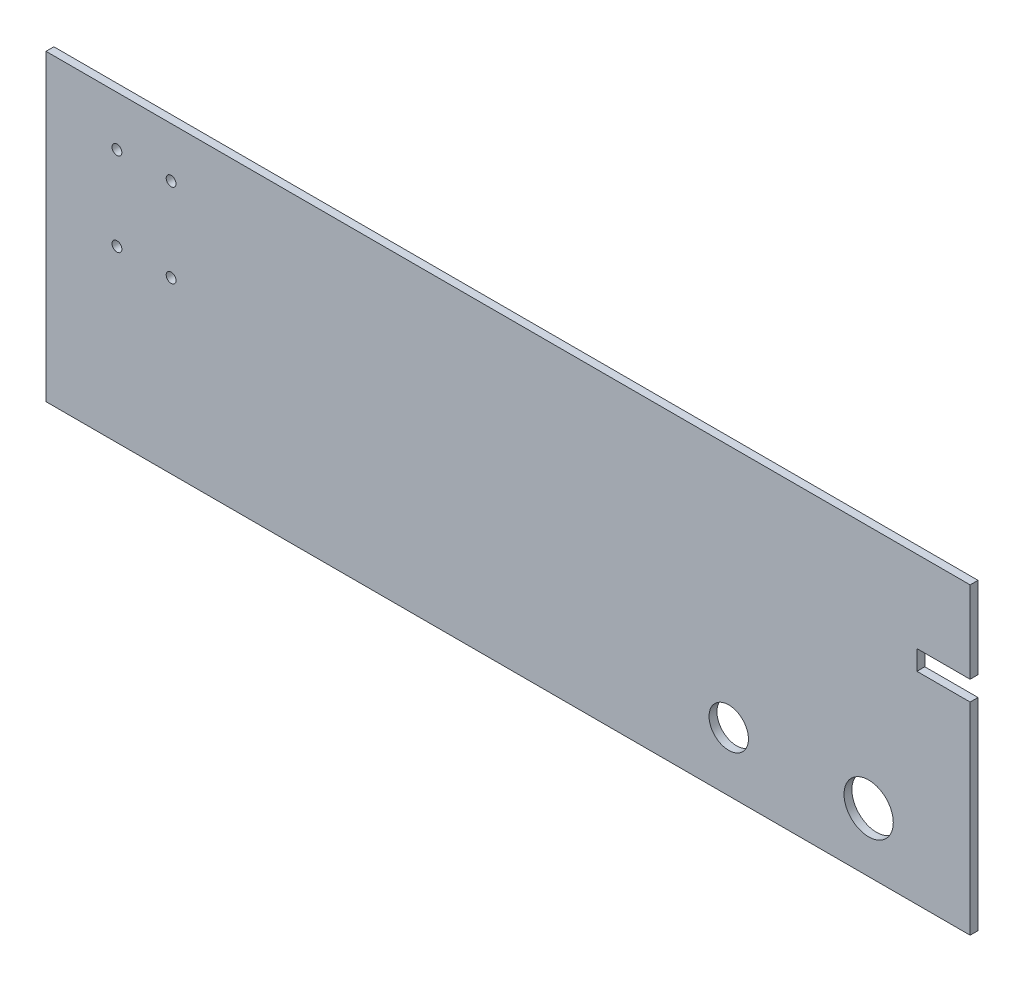
ISO-10303-21;
HEADER;
FILE_DESCRIPTION(('STEP AP214'),'2;1');
FILE_NAME('part.step','',(''),(''),'','','');
FILE_SCHEMA(('AUTOMOTIVE_DESIGN { 1 0 10303 214 1 1 1 1 }'));
ENDSEC;
DATA;
#1=APPLICATION_CONTEXT('core data for automotive mechanical design processes');
#2=APPLICATION_PROTOCOL_DEFINITION('international standard','automotive_design',2000,#1);
#3=PRODUCT_CONTEXT('',#1,'mechanical');
#4=PRODUCT('Part','Part','',(#3));
#5=PRODUCT_RELATED_PRODUCT_CATEGORY('part','',(#4));
#6=PRODUCT_DEFINITION_FORMATION('','',#4);
#7=PRODUCT_DEFINITION_CONTEXT('part definition',#1,'design');
#8=PRODUCT_DEFINITION('design','',#6,#7);
#9=PRODUCT_DEFINITION_SHAPE('','',#8);
#10=(LENGTH_UNIT() NAMED_UNIT(*) SI_UNIT(.MILLI.,.METRE.));
#11=(NAMED_UNIT(*) PLANE_ANGLE_UNIT() SI_UNIT($,.RADIAN.));
#12=(NAMED_UNIT(*) SI_UNIT($,.STERADIAN.) SOLID_ANGLE_UNIT());
#13=UNCERTAINTY_MEASURE_WITH_UNIT(LENGTH_MEASURE(1.E-05),#10,'distance_accuracy_value','');
#14=(GEOMETRIC_REPRESENTATION_CONTEXT(3) GLOBAL_UNCERTAINTY_ASSIGNED_CONTEXT((#13)) GLOBAL_UNIT_ASSIGNED_CONTEXT((#10,
#11,#12)) REPRESENTATION_CONTEXT('',''));
#15=CARTESIAN_POINT('',(0.,0.,0.));
#16=DIRECTION('',(0.,0.,1.));
#17=DIRECTION('',(1.,0.,0.));
#18=AXIS2_PLACEMENT_3D('',#15,#16,#17);
#19=CARTESIAN_POINT('',(-693.,248.,-8.));
#20=DIRECTION('',(-1.,0.,0.));
#21=DIRECTION('',(0.,0.,1.));
#22=AXIS2_PLACEMENT_3D('',#19,#20,#21);
#23=PLANE('',#22);
#24=DIRECTION('',(0.,-1.,0.));
#25=VECTOR('',#24,1.);
#26=CARTESIAN_POINT('',(-693.,248.,0.));
#27=LINE('',#26,#25);
#28=CARTESIAN_POINT('',(-693.,248.,0.));
#29=VERTEX_POINT('',#28);
#30=CARTESIAN_POINT('',(-693.,-60.,0.));
#31=VERTEX_POINT('',#30);
#32=EDGE_CURVE('E106',#29,#31,#27,.T.);
#33=ORIENTED_EDGE('',*,*,#32,.F.);
#34=DIRECTION('',(0.,0.,1.));
#35=VECTOR('',#34,1.);
#36=CARTESIAN_POINT('',(-693.,248.,-8.));
#37=LINE('',#36,#35);
#38=CARTESIAN_POINT('',(-693.,248.,-8.));
#39=VERTEX_POINT('',#38);
#40=EDGE_CURVE('E11',#39,#29,#37,.T.);
#41=ORIENTED_EDGE('',*,*,#40,.F.);
#42=DIRECTION('',(0.,-1.,0.));
#43=VECTOR('',#42,1.);
#44=CARTESIAN_POINT('',(-693.,248.,-8.));
#45=LINE('',#44,#43);
#46=CARTESIAN_POINT('',(-693.,-60.,-8.));
#47=VERTEX_POINT('',#46);
#48=EDGE_CURVE('E108',#39,#47,#45,.T.);
#49=ORIENTED_EDGE('',*,*,#48,.T.);
#50=DIRECTION('',(0.,0.,1.));
#51=VECTOR('',#50,1.);
#52=CARTESIAN_POINT('',(-693.,-60.,-8.));
#53=LINE('',#52,#51);
#54=EDGE_CURVE('E44',#47,#31,#53,.T.);
#55=ORIENTED_EDGE('',*,*,#54,.T.);
#56=EDGE_LOOP('',(#33,#41,#49,#55));
#57=FACE_BOUND('',#56,.T.);
#58=ADVANCED_FACE('F41',(#57),#23,.T.);
#59=CARTESIAN_POINT('',(-693.,248.,-8.));
#60=DIRECTION('',(0.,1.,0.));
#61=DIRECTION('',(0.,0.,1.));
#62=AXIS2_PLACEMENT_3D('',#59,#60,#61);
#63=PLANE('',#62);
#64=DIRECTION('',(-1.,0.,0.));
#65=VECTOR('',#64,1.);
#66=CARTESIAN_POINT('',(-693.,248.,0.));
#67=LINE('',#66,#65);
#68=CARTESIAN_POINT('',(245.,248.,0.));
#69=VERTEX_POINT('',#68);
#70=EDGE_CURVE('E126',#69,#29,#67,.T.);
#71=ORIENTED_EDGE('',*,*,#70,.F.);
#72=DIRECTION('',(0.,0.,1.));
#73=VECTOR('',#72,1.);
#74=CARTESIAN_POINT('',(245.,248.,-8.));
#75=LINE('',#74,#73);
#76=CARTESIAN_POINT('',(245.,248.,-8.));
#77=VERTEX_POINT('',#76);
#78=EDGE_CURVE('E50',#77,#69,#75,.T.);
#79=ORIENTED_EDGE('',*,*,#78,.F.);
#80=DIRECTION('',(-1.,0.,0.));
#81=VECTOR('',#80,1.);
#82=CARTESIAN_POINT('',(-693.,248.,-8.));
#83=LINE('',#82,#81);
#84=EDGE_CURVE('E114',#77,#39,#83,.T.);
#85=ORIENTED_EDGE('',*,*,#84,.T.);
#86=ORIENTED_EDGE('',*,*,#40,.T.);
#87=EDGE_LOOP('',(#71,#79,#85,#86));
#88=FACE_BOUND('',#87,.T.);
#89=ADVANCED_FACE('F262',(#88),#63,.T.);
#90=CARTESIAN_POINT('',(245.,248.,-8.));
#91=DIRECTION('',(1.,0.,0.));
#92=DIRECTION('',(0.,0.,-1.));
#93=AXIS2_PLACEMENT_3D('',#90,#91,#92);
#94=PLANE('',#93);
#95=DIRECTION('',(0.,1.,0.));
#96=VECTOR('',#95,1.);
#97=CARTESIAN_POINT('',(245.,248.,0.));
#98=LINE('',#97,#96);
#99=CARTESIAN_POINT('',(245.,165.,0.));
#100=VERTEX_POINT('',#99);
#101=EDGE_CURVE('E152',#100,#69,#98,.T.);
#102=ORIENTED_EDGE('',*,*,#101,.F.);
#103=DIRECTION('',(0.,0.,1.));
#104=VECTOR('',#103,1.);
#105=CARTESIAN_POINT('',(245.,165.,-8.));
#106=LINE('',#105,#104);
#107=CARTESIAN_POINT('',(245.,165.,-8.));
#108=VERTEX_POINT('',#107);
#109=EDGE_CURVE('E184',#108,#100,#106,.T.);
#110=ORIENTED_EDGE('',*,*,#109,.F.);
#111=DIRECTION('',(0.,1.,0.));
#112=VECTOR('',#111,1.);
#113=CARTESIAN_POINT('',(245.,248.,-8.));
#114=LINE('',#113,#112);
#115=EDGE_CURVE('E177',#108,#77,#114,.T.);
#116=ORIENTED_EDGE('',*,*,#115,.T.);
#117=ORIENTED_EDGE('',*,*,#78,.T.);
#118=EDGE_LOOP('',(#102,#110,#116,#117));
#119=FACE_BOUND('',#118,.T.);
#120=ADVANCED_FACE('F266',(#119),#94,.T.);
#121=CARTESIAN_POINT('',(245.,165.,-8.));
#122=DIRECTION('',(0.,-1.,0.));
#123=DIRECTION('',(0.,0.,-1.));
#124=AXIS2_PLACEMENT_3D('',#121,#122,#123);
#125=PLANE('',#124);
#126=DIRECTION('',(1.,0.,0.));
#127=VECTOR('',#126,1.);
#128=CARTESIAN_POINT('',(245.,165.,0.));
#129=LINE('',#128,#127);
#130=CARTESIAN_POINT('',(191.,165.,0.));
#131=VERTEX_POINT('',#130);
#132=EDGE_CURVE('E148',#131,#100,#129,.T.);
#133=ORIENTED_EDGE('',*,*,#132,.F.);
#134=DIRECTION('',(0.,0.,1.));
#135=VECTOR('',#134,1.);
#136=CARTESIAN_POINT('',(191.,165.,-8.));
#137=LINE('',#136,#135);
#138=CARTESIAN_POINT('',(191.,165.,-8.));
#139=VERTEX_POINT('',#138);
#140=EDGE_CURVE('E187',#139,#131,#137,.T.);
#141=ORIENTED_EDGE('',*,*,#140,.F.);
#142=DIRECTION('',(1.,0.,0.));
#143=VECTOR('',#142,1.);
#144=CARTESIAN_POINT('',(245.,165.,-8.));
#145=LINE('',#144,#143);
#146=EDGE_CURVE('E173',#139,#108,#145,.T.);
#147=ORIENTED_EDGE('',*,*,#146,.T.);
#148=ORIENTED_EDGE('',*,*,#109,.T.);
#149=EDGE_LOOP('',(#133,#141,#147,#148));
#150=FACE_BOUND('',#149,.T.);
#151=ADVANCED_FACE('F271',(#150),#125,.T.);
#152=CARTESIAN_POINT('',(191.,165.,-8.));
#153=DIRECTION('',(1.,0.,0.));
#154=DIRECTION('',(0.,0.,-1.));
#155=AXIS2_PLACEMENT_3D('',#152,#153,#154);
#156=PLANE('',#155);
#157=DIRECTION('',(0.,1.,0.));
#158=VECTOR('',#157,1.);
#159=CARTESIAN_POINT('',(191.,165.,0.));
#160=LINE('',#159,#158);
#161=CARTESIAN_POINT('',(191.,145.,0.));
#162=VERTEX_POINT('',#161);
#163=EDGE_CURVE('E144',#162,#131,#160,.T.);
#164=ORIENTED_EDGE('',*,*,#163,.F.);
#165=DIRECTION('',(0.,0.,1.));
#166=VECTOR('',#165,1.);
#167=CARTESIAN_POINT('',(191.,145.,-8.));
#168=LINE('',#167,#166);
#169=CARTESIAN_POINT('',(191.,145.,-8.));
#170=VERTEX_POINT('',#169);
#171=EDGE_CURVE('E190',#170,#162,#168,.T.);
#172=ORIENTED_EDGE('',*,*,#171,.F.);
#173=DIRECTION('',(0.,1.,0.));
#174=VECTOR('',#173,1.);
#175=CARTESIAN_POINT('',(191.,165.,-8.));
#176=LINE('',#175,#174);
#177=EDGE_CURVE('E169',#170,#139,#176,.T.);
#178=ORIENTED_EDGE('',*,*,#177,.T.);
#179=ORIENTED_EDGE('',*,*,#140,.T.);
#180=EDGE_LOOP('',(#164,#172,#178,#179));
#181=FACE_BOUND('',#180,.T.);
#182=ADVANCED_FACE('F278',(#181),#156,.T.);
#183=CARTESIAN_POINT('',(245.,145.,-8.));
#184=DIRECTION('',(0.,1.,0.));
#185=DIRECTION('',(0.,0.,1.));
#186=AXIS2_PLACEMENT_3D('',#183,#184,#185);
#187=PLANE('',#186);
#188=DIRECTION('',(-1.,0.,0.));
#189=VECTOR('',#188,1.);
#190=CARTESIAN_POINT('',(245.,145.,0.));
#191=LINE('',#190,#189);
#192=CARTESIAN_POINT('',(245.,145.,0.));
#193=VERTEX_POINT('',#192);
#194=EDGE_CURVE('E140',#193,#162,#191,.T.);
#195=ORIENTED_EDGE('',*,*,#194,.F.);
#196=DIRECTION('',(0.,0.,1.));
#197=VECTOR('',#196,1.);
#198=CARTESIAN_POINT('',(245.,145.,-8.));
#199=LINE('',#198,#197);
#200=CARTESIAN_POINT('',(245.,145.,-8.));
#201=VERTEX_POINT('',#200);
#202=EDGE_CURVE('E193',#201,#193,#199,.T.);
#203=ORIENTED_EDGE('',*,*,#202,.F.);
#204=DIRECTION('',(-1.,0.,0.));
#205=VECTOR('',#204,1.);
#206=CARTESIAN_POINT('',(245.,145.,-8.));
#207=LINE('',#206,#205);
#208=EDGE_CURVE('E165',#201,#170,#207,.T.);
#209=ORIENTED_EDGE('',*,*,#208,.T.);
#210=ORIENTED_EDGE('',*,*,#171,.T.);
#211=EDGE_LOOP('',(#195,#203,#209,#210));
#212=FACE_BOUND('',#211,.T.);
#213=ADVANCED_FACE('F282',(#212),#187,.T.);
#214=CARTESIAN_POINT('',(245.,145.,-8.));
#215=DIRECTION('',(1.,0.,0.));
#216=DIRECTION('',(0.,0.,-1.));
#217=AXIS2_PLACEMENT_3D('',#214,#215,#216);
#218=PLANE('',#217);
#219=DIRECTION('',(0.,1.,0.));
#220=VECTOR('',#219,1.);
#221=CARTESIAN_POINT('',(245.,145.,0.));
#222=LINE('',#221,#220);
#223=CARTESIAN_POINT('',(245.,-60.,0.));
#224=VERTEX_POINT('',#223);
#225=EDGE_CURVE('E122',#224,#193,#222,.T.);
#226=ORIENTED_EDGE('',*,*,#225,.F.);
#227=DIRECTION('',(0.,0.,1.));
#228=VECTOR('',#227,1.);
#229=CARTESIAN_POINT('',(245.,-60.,-8.));
#230=LINE('',#229,#228);
#231=CARTESIAN_POINT('',(245.,-60.,-8.));
#232=VERTEX_POINT('',#231);
#233=EDGE_CURVE('E113',#232,#224,#230,.T.);
#234=ORIENTED_EDGE('',*,*,#233,.F.);
#235=DIRECTION('',(0.,1.,0.));
#236=VECTOR('',#235,1.);
#237=CARTESIAN_POINT('',(245.,145.,-8.));
#238=LINE('',#237,#236);
#239=EDGE_CURVE('E161',#232,#201,#238,.T.);
#240=ORIENTED_EDGE('',*,*,#239,.T.);
#241=ORIENTED_EDGE('',*,*,#202,.T.);
#242=EDGE_LOOP('',(#226,#234,#240,#241));
#243=FACE_BOUND('',#242,.T.);
#244=ADVANCED_FACE('F286',(#243),#218,.T.);
#245=CARTESIAN_POINT('',(-693.,-60.,-8.));
#246=DIRECTION('',(0.,-1.,0.));
#247=DIRECTION('',(0.,0.,-1.));
#248=AXIS2_PLACEMENT_3D('',#245,#246,#247);
#249=PLANE('',#248);
#250=DIRECTION('',(1.,0.,0.));
#251=VECTOR('',#250,1.);
#252=CARTESIAN_POINT('',(-693.,-60.,0.));
#253=LINE('',#252,#251);
#254=EDGE_CURVE('E116',#31,#224,#253,.T.);
#255=ORIENTED_EDGE('',*,*,#254,.F.);
#256=ORIENTED_EDGE('',*,*,#54,.F.);
#257=DIRECTION('',(1.,0.,0.));
#258=VECTOR('',#257,1.);
#259=CARTESIAN_POINT('',(-693.,-60.,-8.));
#260=LINE('',#259,#258);
#261=EDGE_CURVE('E158',#47,#232,#260,.T.);
#262=ORIENTED_EDGE('',*,*,#261,.T.);
#263=ORIENTED_EDGE('',*,*,#233,.T.);
#264=EDGE_LOOP('',(#255,#256,#262,#263));
#265=FACE_BOUND('',#264,.T.);
#266=ADVANCED_FACE('F117',(#265),#249,.T.);
#267=CARTESIAN_POINT('',(-693.,-60.,-8.));
#268=DIRECTION('',(0.,0.,1.));
#269=DIRECTION('',(1.,0.,0.));
#270=AXIS2_PLACEMENT_3D('',#267,#268,#269);
#271=PLANE('',#270);
#272=CARTESIAN_POINT('',(142.,0.,-8.));
#273=DIRECTION('',(0.,0.,1.));
#274=DIRECTION('',(1.,0.,0.));
#275=AXIS2_PLACEMENT_3D('',#272,#273,#274);
#276=CIRCLE('',#275,25.);
#277=CARTESIAN_POINT('',(167.,0.,-8.));
#278=VERTEX_POINT('',#277);
#279=EDGE_CURVE('E204',#278,#278,#276,.T.);
#280=ORIENTED_EDGE('',*,*,#279,.T.);
#281=EDGE_LOOP('',(#280));
#282=FACE_BOUND('',#281,.T.);
#283=CARTESIAN_POINT('',(-621.,112.5,-8.));
#284=DIRECTION('',(0.,0.,1.));
#285=DIRECTION('',(-1.,0.,0.));
#286=AXIS2_PLACEMENT_3D('',#283,#284,#285);
#287=CIRCLE('',#286,5.00000000000005);
#288=CARTESIAN_POINT('',(-626.,112.5,-8.));
#289=VERTEX_POINT('',#288);
#290=EDGE_CURVE('E203',#289,#289,#287,.T.);
#291=ORIENTED_EDGE('',*,*,#290,.T.);
#292=EDGE_LOOP('',(#291));
#293=FACE_BOUND('',#292,.T.);
#294=CARTESIAN_POINT('',(-566.,112.5,-8.));
#295=DIRECTION('',(0.,0.,1.));
#296=DIRECTION('',(1.,0.,0.));
#297=AXIS2_PLACEMENT_3D('',#294,#295,#296);
#298=CIRCLE('',#297,5.00000000000005);
#299=CARTESIAN_POINT('',(-561.,112.5,-8.));
#300=VERTEX_POINT('',#299);
#301=EDGE_CURVE('E214',#300,#300,#298,.T.);
#302=ORIENTED_EDGE('',*,*,#301,.T.);
#303=EDGE_LOOP('',(#302));
#304=FACE_BOUND('',#303,.T.);
#305=CARTESIAN_POINT('',(-566.,197.5,-8.));
#306=DIRECTION('',(0.,0.,1.));
#307=DIRECTION('',(-1.,0.,0.));
#308=AXIS2_PLACEMENT_3D('',#305,#306,#307);
#309=CIRCLE('',#308,5.00000000000005);
#310=CARTESIAN_POINT('',(-571.,197.5,-8.));
#311=VERTEX_POINT('',#310);
#312=EDGE_CURVE('E213',#311,#311,#309,.T.);
#313=ORIENTED_EDGE('',*,*,#312,.T.);
#314=EDGE_LOOP('',(#313));
#315=FACE_BOUND('',#314,.T.);
#316=CARTESIAN_POINT('',(-621.,197.5,-8.));
#317=DIRECTION('',(0.,0.,1.));
#318=DIRECTION('',(1.,0.,0.));
#319=AXIS2_PLACEMENT_3D('',#316,#317,#318);
#320=CIRCLE('',#319,5.00000000000005);
#321=CARTESIAN_POINT('',(-616.,197.5,-8.));
#322=VERTEX_POINT('',#321);
#323=EDGE_CURVE('E199',#322,#322,#320,.T.);
#324=ORIENTED_EDGE('',*,*,#323,.T.);
#325=EDGE_LOOP('',(#324));
#326=FACE_BOUND('',#325,.T.);
#327=CARTESIAN_POINT('',(0.,0.,-8.));
#328=DIRECTION('',(0.,0.,1.));
#329=DIRECTION('',(1.,0.,0.));
#330=AXIS2_PLACEMENT_3D('',#327,#328,#329);
#331=CIRCLE('',#330,20.);
#332=CARTESIAN_POINT('',(20.,0.,-8.));
#333=VERTEX_POINT('',#332);
#334=EDGE_CURVE('E128',#333,#333,#331,.T.);
#335=ORIENTED_EDGE('',*,*,#334,.T.);
#336=EDGE_LOOP('',(#335));
#337=FACE_BOUND('',#336,.T.);
#338=ORIENTED_EDGE('',*,*,#48,.F.);
#339=ORIENTED_EDGE('',*,*,#84,.F.);
#340=ORIENTED_EDGE('',*,*,#115,.F.);
#341=ORIENTED_EDGE('',*,*,#146,.F.);
#342=ORIENTED_EDGE('',*,*,#177,.F.);
#343=ORIENTED_EDGE('',*,*,#208,.F.);
#344=ORIENTED_EDGE('',*,*,#239,.F.);
#345=ORIENTED_EDGE('',*,*,#261,.F.);
#346=EDGE_LOOP('',(#338,#339,#340,#341,#342,#343,#344,#345));
#347=FACE_BOUND('',#346,.T.);
#348=ADVANCED_FACE('F246',(#282,#293,#304,#315,#326,#337,#347),#271,.F.);
#349=CARTESIAN_POINT('',(-693.,-60.,0.));
#350=DIRECTION('',(0.,0.,1.));
#351=DIRECTION('',(1.,0.,0.));
#352=AXIS2_PLACEMENT_3D('',#349,#350,#351);
#353=PLANE('',#352);
#354=CARTESIAN_POINT('',(142.,0.,0.));
#355=DIRECTION('',(0.,0.,1.));
#356=DIRECTION('',(1.,0.,0.));
#357=AXIS2_PLACEMENT_3D('',#354,#355,#356);
#358=CIRCLE('',#357,25.);
#359=CARTESIAN_POINT('',(167.,0.,0.));
#360=VERTEX_POINT('',#359);
#361=EDGE_CURVE('E223',#360,#360,#358,.T.);
#362=ORIENTED_EDGE('',*,*,#361,.F.);
#363=EDGE_LOOP('',(#362));
#364=FACE_BOUND('',#363,.T.);
#365=CARTESIAN_POINT('',(-621.,112.5,0.));
#366=DIRECTION('',(0.,0.,1.));
#367=DIRECTION('',(-1.,0.,0.));
#368=AXIS2_PLACEMENT_3D('',#365,#366,#367);
#369=CIRCLE('',#368,5.00000000000005);
#370=CARTESIAN_POINT('',(-626.,112.5,0.));
#371=VERTEX_POINT('',#370);
#372=EDGE_CURVE('E200',#371,#371,#369,.T.);
#373=ORIENTED_EDGE('',*,*,#372,.F.);
#374=EDGE_LOOP('',(#373));
#375=FACE_BOUND('',#374,.T.);
#376=CARTESIAN_POINT('',(-566.,112.5,0.));
#377=DIRECTION('',(0.,0.,1.));
#378=DIRECTION('',(1.,0.,0.));
#379=AXIS2_PLACEMENT_3D('',#376,#377,#378);
#380=CIRCLE('',#379,5.00000000000005);
#381=CARTESIAN_POINT('',(-561.,112.5,0.));
#382=VERTEX_POINT('',#381);
#383=EDGE_CURVE('E207',#382,#382,#380,.T.);
#384=ORIENTED_EDGE('',*,*,#383,.F.);
#385=EDGE_LOOP('',(#384));
#386=FACE_BOUND('',#385,.T.);
#387=CARTESIAN_POINT('',(-566.,197.5,0.));
#388=DIRECTION('',(0.,0.,1.));
#389=DIRECTION('',(-1.,0.,0.));
#390=AXIS2_PLACEMENT_3D('',#387,#388,#389);
#391=CIRCLE('',#390,5.00000000000005);
#392=CARTESIAN_POINT('',(-571.,197.5,0.));
#393=VERTEX_POINT('',#392);
#394=EDGE_CURVE('E210',#393,#393,#391,.T.);
#395=ORIENTED_EDGE('',*,*,#394,.F.);
#396=EDGE_LOOP('',(#395));
#397=FACE_BOUND('',#396,.T.);
#398=CARTESIAN_POINT('',(-621.,197.5,0.));
#399=DIRECTION('',(0.,0.,1.));
#400=DIRECTION('',(1.,0.,0.));
#401=AXIS2_PLACEMENT_3D('',#398,#399,#400);
#402=CIRCLE('',#401,5.00000000000005);
#403=CARTESIAN_POINT('',(-616.,197.5,0.));
#404=VERTEX_POINT('',#403);
#405=EDGE_CURVE('E218',#404,#404,#402,.T.);
#406=ORIENTED_EDGE('',*,*,#405,.F.);
#407=EDGE_LOOP('',(#406));
#408=FACE_BOUND('',#407,.T.);
#409=CARTESIAN_POINT('',(0.,0.,0.));
#410=DIRECTION('',(0.,0.,1.));
#411=DIRECTION('',(1.,0.,0.));
#412=AXIS2_PLACEMENT_3D('',#409,#410,#411);
#413=CIRCLE('',#412,20.);
#414=CARTESIAN_POINT('',(20.,0.,0.));
#415=VERTEX_POINT('',#414);
#416=EDGE_CURVE('E134',#415,#415,#413,.T.);
#417=ORIENTED_EDGE('',*,*,#416,.F.);
#418=EDGE_LOOP('',(#417));
#419=FACE_BOUND('',#418,.T.);
#420=ORIENTED_EDGE('',*,*,#32,.T.);
#421=ORIENTED_EDGE('',*,*,#254,.T.);
#422=ORIENTED_EDGE('',*,*,#225,.T.);
#423=ORIENTED_EDGE('',*,*,#194,.T.);
#424=ORIENTED_EDGE('',*,*,#163,.T.);
#425=ORIENTED_EDGE('',*,*,#132,.T.);
#426=ORIENTED_EDGE('',*,*,#101,.T.);
#427=ORIENTED_EDGE('',*,*,#70,.T.);
#428=EDGE_LOOP('',(#420,#421,#422,#423,#424,#425,#426,#427));
#429=FACE_BOUND('',#428,.T.);
#430=ADVANCED_FACE('F124',(#364,#375,#386,#397,#408,#419,#429),#353,.T.);
#431=CARTESIAN_POINT('',(0.,0.,-8.));
#432=DIRECTION('',(0.,0.,1.));
#433=DIRECTION('',(1.,0.,0.));
#434=AXIS2_PLACEMENT_3D('',#431,#432,#433);
#435=CYLINDRICAL_SURFACE('',#434,20.);
#436=ORIENTED_EDGE('',*,*,#334,.F.);
#437=EDGE_LOOP('',(#436));
#438=FACE_BOUND('',#437,.T.);
#439=ORIENTED_EDGE('',*,*,#416,.T.);
#440=EDGE_LOOP('',(#439));
#441=FACE_BOUND('',#440,.T.);
#442=ADVANCED_FACE('F245',(#438,#441),#435,.F.);
#443=CARTESIAN_POINT('',(-621.,197.5,-8.));
#444=DIRECTION('',(0.,0.,1.));
#445=DIRECTION('',(1.,0.,0.));
#446=AXIS2_PLACEMENT_3D('',#443,#444,#445);
#447=CYLINDRICAL_SURFACE('',#446,5.00000000000005);
#448=ORIENTED_EDGE('',*,*,#323,.F.);
#449=EDGE_LOOP('',(#448));
#450=FACE_BOUND('',#449,.T.);
#451=ORIENTED_EDGE('',*,*,#405,.T.);
#452=EDGE_LOOP('',(#451));
#453=FACE_BOUND('',#452,.T.);
#454=ADVANCED_FACE('F241',(#450,#453),#447,.F.);
#455=CARTESIAN_POINT('',(-566.,197.5,-8.));
#456=DIRECTION('',(0.,0.,1.));
#457=DIRECTION('',(1.,0.,0.));
#458=AXIS2_PLACEMENT_3D('',#455,#456,#457);
#459=CYLINDRICAL_SURFACE('',#458,5.00000000000005);
#460=ORIENTED_EDGE('',*,*,#312,.F.);
#461=EDGE_LOOP('',(#460));
#462=FACE_BOUND('',#461,.T.);
#463=ORIENTED_EDGE('',*,*,#394,.T.);
#464=EDGE_LOOP('',(#463));
#465=FACE_BOUND('',#464,.T.);
#466=ADVANCED_FACE('F257',(#462,#465),#459,.F.);
#467=CARTESIAN_POINT('',(-566.,112.5,-8.));
#468=DIRECTION('',(0.,0.,1.));
#469=DIRECTION('',(1.,0.,0.));
#470=AXIS2_PLACEMENT_3D('',#467,#468,#469);
#471=CYLINDRICAL_SURFACE('',#470,5.00000000000005);
#472=ORIENTED_EDGE('',*,*,#301,.F.);
#473=EDGE_LOOP('',(#472));
#474=FACE_BOUND('',#473,.T.);
#475=ORIENTED_EDGE('',*,*,#383,.T.);
#476=EDGE_LOOP('',(#475));
#477=FACE_BOUND('',#476,.T.);
#478=ADVANCED_FACE('F319',(#474,#477),#471,.F.);
#479=CARTESIAN_POINT('',(-621.,112.5,-8.));
#480=DIRECTION('',(0.,0.,1.));
#481=DIRECTION('',(1.,0.,0.));
#482=AXIS2_PLACEMENT_3D('',#479,#480,#481);
#483=CYLINDRICAL_SURFACE('',#482,5.00000000000005);
#484=ORIENTED_EDGE('',*,*,#290,.F.);
#485=EDGE_LOOP('',(#484));
#486=FACE_BOUND('',#485,.T.);
#487=ORIENTED_EDGE('',*,*,#372,.T.);
#488=EDGE_LOOP('',(#487));
#489=FACE_BOUND('',#488,.T.);
#490=ADVANCED_FACE('F326',(#486,#489),#483,.F.);
#491=CARTESIAN_POINT('',(142.,0.,-8.));
#492=DIRECTION('',(0.,0.,1.));
#493=DIRECTION('',(1.,0.,0.));
#494=AXIS2_PLACEMENT_3D('',#491,#492,#493);
#495=CYLINDRICAL_SURFACE('',#494,25.);
#496=ORIENTED_EDGE('',*,*,#279,.F.);
#497=EDGE_LOOP('',(#496));
#498=FACE_BOUND('',#497,.T.);
#499=ORIENTED_EDGE('',*,*,#361,.T.);
#500=EDGE_LOOP('',(#499));
#501=FACE_BOUND('',#500,.T.);
#502=ADVANCED_FACE('F332',(#498,#501),#495,.F.);
#503=CLOSED_SHELL('',(#58,#89,#120,#151,#182,#213,#244,#266,#348,#430,#442,#454,#466,#478,#490,#502));
#504=MANIFOLD_SOLID_BREP('B2',#503);
#505=ADVANCED_BREP_SHAPE_REPRESENTATION('',(#18,#504),#14);
#506=SHAPE_DEFINITION_REPRESENTATION(#9,#505);
ENDSEC;
END-ISO-10303-21;
